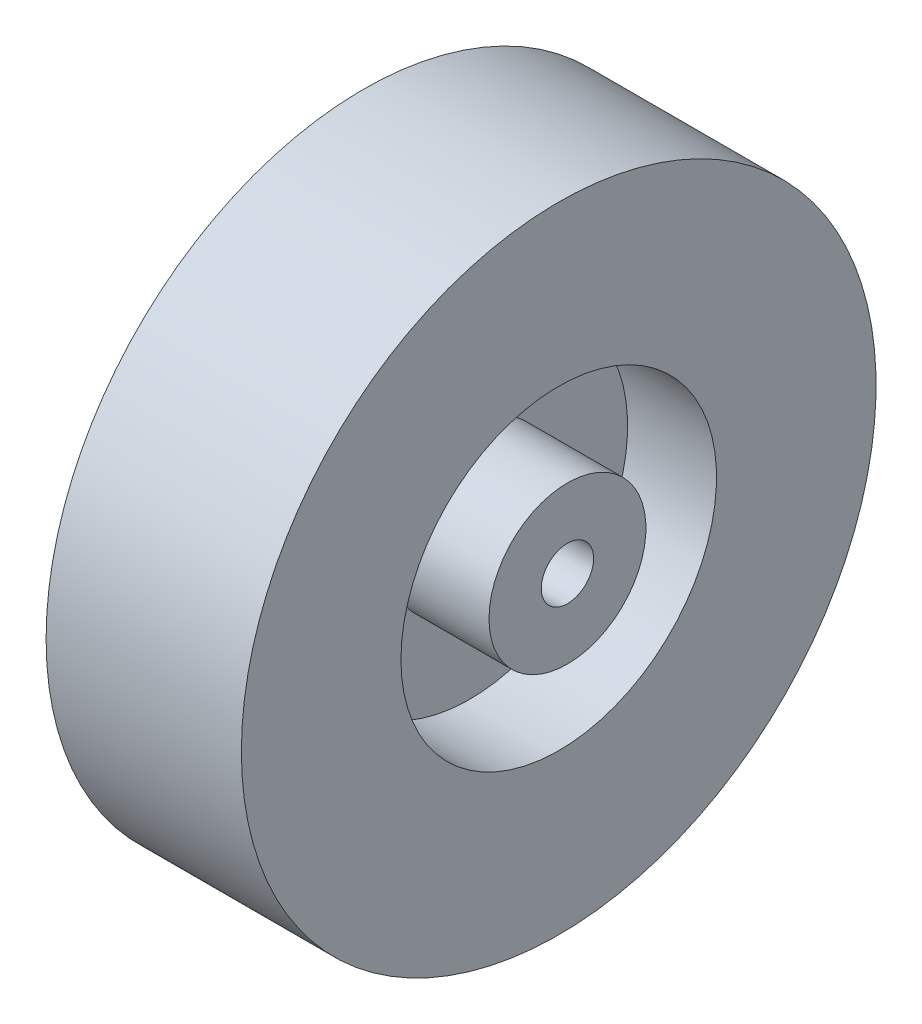
ISO-10303-21;
HEADER;
FILE_DESCRIPTION(('STEP AP214'),'2;1');
FILE_NAME('part.step','',(''),(''),'','','');
FILE_SCHEMA(('AUTOMOTIVE_DESIGN { 1 0 10303 214 1 1 1 1 }'));
ENDSEC;
DATA;
#1=APPLICATION_CONTEXT('core data for automotive mechanical design processes');
#2=APPLICATION_PROTOCOL_DEFINITION('international standard','automotive_design',2000,#1);
#3=PRODUCT_CONTEXT('',#1,'mechanical');
#4=PRODUCT('Part','Part','',(#3));
#5=PRODUCT_RELATED_PRODUCT_CATEGORY('part','',(#4));
#6=PRODUCT_DEFINITION_FORMATION('','',#4);
#7=PRODUCT_DEFINITION_CONTEXT('part definition',#1,'design');
#8=PRODUCT_DEFINITION('design','',#6,#7);
#9=PRODUCT_DEFINITION_SHAPE('','',#8);
#10=(LENGTH_UNIT() NAMED_UNIT(*) SI_UNIT(.MILLI.,.METRE.));
#11=(NAMED_UNIT(*) PLANE_ANGLE_UNIT() SI_UNIT($,.RADIAN.));
#12=(NAMED_UNIT(*) SI_UNIT($,.STERADIAN.) SOLID_ANGLE_UNIT());
#13=UNCERTAINTY_MEASURE_WITH_UNIT(LENGTH_MEASURE(1.E-05),#10,'distance_accuracy_value','');
#14=(GEOMETRIC_REPRESENTATION_CONTEXT(3) GLOBAL_UNCERTAINTY_ASSIGNED_CONTEXT((#13)) GLOBAL_UNIT_ASSIGNED_CONTEXT((#10,
#11,#12)) REPRESENTATION_CONTEXT('',''));
#15=CARTESIAN_POINT('',(0.,0.,0.));
#16=DIRECTION('',(0.,0.,1.));
#17=DIRECTION('',(1.,0.,0.));
#18=AXIS2_PLACEMENT_3D('',#15,#16,#17);
#19=CARTESIAN_POINT('',(-0.0128570073831025,0.,0.));
#20=DIRECTION('',(-1.,0.,0.));
#21=DIRECTION('',(0.,0.,1.));
#22=AXIS2_PLACEMENT_3D('',#19,#20,#21);
#23=CYLINDRICAL_SURFACE('',#22,4.5);
#24=CARTESIAN_POINT('',(0.487142992616897,0.,0.));
#25=DIRECTION('',(-1.,0.,0.));
#26=DIRECTION('',(0.,0.,1.));
#27=AXIS2_PLACEMENT_3D('',#24,#25,#26);
#28=CIRCLE('',#27,4.5);
#29=CARTESIAN_POINT('',(0.487142992616897,0.,4.5));
#30=VERTEX_POINT('',#29);
#31=EDGE_CURVE('E69',#30,#30,#28,.T.);
#32=ORIENTED_EDGE('',*,*,#31,.F.);
#33=EDGE_LOOP('',(#32));
#34=FACE_BOUND('',#33,.T.);
#35=CARTESIAN_POINT('',(6.0871429926169,0.,0.));
#36=DIRECTION('',(-1.,0.,0.));
#37=DIRECTION('',(0.,0.,1.));
#38=AXIS2_PLACEMENT_3D('',#35,#36,#37);
#39=CIRCLE('',#38,4.5);
#40=CARTESIAN_POINT('',(6.0871429926169,0.,4.5));
#41=VERTEX_POINT('',#40);
#42=EDGE_CURVE('E10',#41,#41,#39,.T.);
#43=ORIENTED_EDGE('',*,*,#42,.T.);
#44=EDGE_LOOP('',(#43));
#45=FACE_BOUND('',#44,.T.);
#46=ADVANCED_FACE('F35',(#34,#45),#23,.T.);
#47=CARTESIAN_POINT('',(6.0871429926169,4.5,0.));
#48=DIRECTION('',(-1.,0.,0.));
#49=DIRECTION('',(0.,0.,1.));
#50=AXIS2_PLACEMENT_3D('',#47,#48,#49);
#51=PLANE('',#50);
#52=CARTESIAN_POINT('',(6.0871429926169,0.,0.));
#53=DIRECTION('',(1.,0.,0.));
#54=DIRECTION('',(0.,0.,-1.));
#55=AXIS2_PLACEMENT_3D('',#52,#53,#54);
#56=CIRCLE('',#55,1.5);
#57=CARTESIAN_POINT('',(6.0871429926169,0.,-1.5));
#58=VERTEX_POINT('',#57);
#59=EDGE_CURVE('E73',#58,#58,#56,.T.);
#60=ORIENTED_EDGE('',*,*,#59,.F.);
#61=EDGE_LOOP('',(#60));
#62=FACE_BOUND('',#61,.T.);
#63=ORIENTED_EDGE('',*,*,#42,.F.);
#64=EDGE_LOOP('',(#63));
#65=FACE_BOUND('',#64,.T.);
#66=ADVANCED_FACE('F88',(#62,#65),#51,.F.);
#67=CARTESIAN_POINT('',(-6.1128570073831,4.5,0.));
#68=DIRECTION('',(1.,0.,0.));
#69=DIRECTION('',(0.,0.,-1.));
#70=AXIS2_PLACEMENT_3D('',#67,#68,#69);
#71=PLANE('',#70);
#72=CARTESIAN_POINT('',(-6.1128570073831,0.,0.));
#73=DIRECTION('',(-1.,0.,0.));
#74=DIRECTION('',(0.,0.,1.));
#75=AXIS2_PLACEMENT_3D('',#72,#73,#74);
#76=CIRCLE('',#75,4.5);
#77=CARTESIAN_POINT('',(-6.1128570073831,0.,4.5));
#78=VERTEX_POINT('',#77);
#79=EDGE_CURVE('E41',#78,#78,#76,.T.);
#80=ORIENTED_EDGE('',*,*,#79,.T.);
#81=EDGE_LOOP('',(#80));
#82=FACE_BOUND('',#81,.T.);
#83=ADVANCED_FACE('F91',(#82),#71,.F.);
#84=CARTESIAN_POINT('',(-0.0128570073831025,0.,0.));
#85=DIRECTION('',(-1.,0.,0.));
#86=DIRECTION('',(0.,0.,1.));
#87=AXIS2_PLACEMENT_3D('',#84,#85,#86);
#88=CYLINDRICAL_SURFACE('',#87,4.5);
#89=ORIENTED_EDGE('',*,*,#79,.F.);
#90=EDGE_LOOP('',(#89));
#91=FACE_BOUND('',#90,.T.);
#92=CARTESIAN_POINT('',(-0.512857007383101,0.,0.));
#93=DIRECTION('',(-1.,0.,0.));
#94=DIRECTION('',(0.,0.,1.));
#95=AXIS2_PLACEMENT_3D('',#92,#93,#94);
#96=CIRCLE('',#95,4.5);
#97=CARTESIAN_POINT('',(-0.512857007383101,0.,4.5));
#98=VERTEX_POINT('',#97);
#99=EDGE_CURVE('E45',#98,#98,#96,.T.);
#100=ORIENTED_EDGE('',*,*,#99,.T.);
#101=EDGE_LOOP('',(#100));
#102=FACE_BOUND('',#101,.T.);
#103=ADVANCED_FACE('F96',(#91,#102),#88,.T.);
#104=CARTESIAN_POINT('',(-0.512857007383101,9.05,0.));
#105=DIRECTION('',(1.,0.,0.));
#106=DIRECTION('',(0.,0.,-1.));
#107=AXIS2_PLACEMENT_3D('',#104,#105,#106);
#108=PLANE('',#107);
#109=ORIENTED_EDGE('',*,*,#99,.F.);
#110=EDGE_LOOP('',(#109));
#111=FACE_BOUND('',#110,.T.);
#112=CARTESIAN_POINT('',(-0.512857007383102,0.,0.));
#113=DIRECTION('',(-1.,0.,0.));
#114=DIRECTION('',(0.,0.,1.));
#115=AXIS2_PLACEMENT_3D('',#112,#113,#114);
#116=CIRCLE('',#115,9.05);
#117=CARTESIAN_POINT('',(-0.512857007383102,0.,9.05));
#118=VERTEX_POINT('',#117);
#119=EDGE_CURVE('E49',#118,#118,#116,.T.);
#120=ORIENTED_EDGE('',*,*,#119,.T.);
#121=EDGE_LOOP('',(#120));
#122=FACE_BOUND('',#121,.T.);
#123=ADVANCED_FACE('F102',(#111,#122),#108,.F.);
#124=CARTESIAN_POINT('',(-0.0128570073831025,0.,0.));
#125=DIRECTION('',(-1.,0.,0.));
#126=DIRECTION('',(0.,0.,1.));
#127=AXIS2_PLACEMENT_3D('',#124,#125,#126);
#128=CYLINDRICAL_SURFACE('',#127,9.05);
#129=ORIENTED_EDGE('',*,*,#119,.F.);
#130=EDGE_LOOP('',(#129));
#131=FACE_BOUND('',#130,.T.);
#132=CARTESIAN_POINT('',(-5.6128570073831,0.,0.));
#133=DIRECTION('',(-1.,0.,0.));
#134=DIRECTION('',(0.,0.,1.));
#135=AXIS2_PLACEMENT_3D('',#132,#133,#134);
#136=CIRCLE('',#135,9.05);
#137=CARTESIAN_POINT('',(-5.6128570073831,0.,9.05));
#138=VERTEX_POINT('',#137);
#139=EDGE_CURVE('E54',#138,#138,#136,.T.);
#140=ORIENTED_EDGE('',*,*,#139,.T.);
#141=EDGE_LOOP('',(#140));
#142=FACE_BOUND('',#141,.T.);
#143=ADVANCED_FACE('F106',(#131,#142),#128,.F.);
#144=CARTESIAN_POINT('',(-5.6128570073831,18.2,0.));
#145=DIRECTION('',(1.,0.,0.));
#146=DIRECTION('',(0.,0.,-1.));
#147=AXIS2_PLACEMENT_3D('',#144,#145,#146);
#148=PLANE('',#147);
#149=ORIENTED_EDGE('',*,*,#139,.F.);
#150=EDGE_LOOP('',(#149));
#151=FACE_BOUND('',#150,.T.);
#152=CARTESIAN_POINT('',(-5.6128570073831,0.,0.));
#153=DIRECTION('',(-1.,0.,0.));
#154=DIRECTION('',(0.,0.,1.));
#155=AXIS2_PLACEMENT_3D('',#152,#153,#154);
#156=CIRCLE('',#155,18.2);
#157=CARTESIAN_POINT('',(-5.6128570073831,0.,18.2));
#158=VERTEX_POINT('',#157);
#159=EDGE_CURVE('E57',#158,#158,#156,.T.);
#160=ORIENTED_EDGE('',*,*,#159,.T.);
#161=EDGE_LOOP('',(#160));
#162=FACE_BOUND('',#161,.T.);
#163=ADVANCED_FACE('F110',(#151,#162),#148,.F.);
#164=CARTESIAN_POINT('',(-0.0128570073831025,0.,0.));
#165=DIRECTION('',(-1.,0.,0.));
#166=DIRECTION('',(0.,0.,1.));
#167=AXIS2_PLACEMENT_3D('',#164,#165,#166);
#168=CYLINDRICAL_SURFACE('',#167,18.2);
#169=ORIENTED_EDGE('',*,*,#159,.F.);
#170=EDGE_LOOP('',(#169));
#171=FACE_BOUND('',#170,.T.);
#172=CARTESIAN_POINT('',(5.5871429926169,0.,0.));
#173=DIRECTION('',(-1.,0.,0.));
#174=DIRECTION('',(0.,0.,1.));
#175=AXIS2_PLACEMENT_3D('',#172,#173,#174);
#176=CIRCLE('',#175,18.2);
#177=CARTESIAN_POINT('',(5.5871429926169,0.,18.2));
#178=VERTEX_POINT('',#177);
#179=EDGE_CURVE('E60',#178,#178,#176,.T.);
#180=ORIENTED_EDGE('',*,*,#179,.T.);
#181=EDGE_LOOP('',(#180));
#182=FACE_BOUND('',#181,.T.);
#183=ADVANCED_FACE('F114',(#171,#182),#168,.T.);
#184=CARTESIAN_POINT('',(5.5871429926169,18.2,0.));
#185=DIRECTION('',(-1.,0.,0.));
#186=DIRECTION('',(0.,0.,1.));
#187=AXIS2_PLACEMENT_3D('',#184,#185,#186);
#188=PLANE('',#187);
#189=ORIENTED_EDGE('',*,*,#179,.F.);
#190=EDGE_LOOP('',(#189));
#191=FACE_BOUND('',#190,.T.);
#192=CARTESIAN_POINT('',(5.5871429926169,0.,0.));
#193=DIRECTION('',(-1.,0.,0.));
#194=DIRECTION('',(0.,0.,1.));
#195=AXIS2_PLACEMENT_3D('',#192,#193,#194);
#196=CIRCLE('',#195,9.05);
#197=CARTESIAN_POINT('',(5.5871429926169,0.,9.05));
#198=VERTEX_POINT('',#197);
#199=EDGE_CURVE('E63',#198,#198,#196,.T.);
#200=ORIENTED_EDGE('',*,*,#199,.T.);
#201=EDGE_LOOP('',(#200));
#202=FACE_BOUND('',#201,.T.);
#203=ADVANCED_FACE('F118',(#191,#202),#188,.F.);
#204=CARTESIAN_POINT('',(-0.0128570073831025,0.,0.));
#205=DIRECTION('',(-1.,0.,0.));
#206=DIRECTION('',(0.,0.,1.));
#207=AXIS2_PLACEMENT_3D('',#204,#205,#206);
#208=CYLINDRICAL_SURFACE('',#207,9.05);
#209=ORIENTED_EDGE('',*,*,#199,.F.);
#210=EDGE_LOOP('',(#209));
#211=FACE_BOUND('',#210,.T.);
#212=CARTESIAN_POINT('',(0.487142992616898,0.,0.));
#213=DIRECTION('',(-1.,0.,0.));
#214=DIRECTION('',(0.,0.,1.));
#215=AXIS2_PLACEMENT_3D('',#212,#213,#214);
#216=CIRCLE('',#215,9.05);
#217=CARTESIAN_POINT('',(0.487142992616898,0.,9.05));
#218=VERTEX_POINT('',#217);
#219=EDGE_CURVE('E66',#218,#218,#216,.T.);
#220=ORIENTED_EDGE('',*,*,#219,.T.);
#221=EDGE_LOOP('',(#220));
#222=FACE_BOUND('',#221,.T.);
#223=ADVANCED_FACE('F122',(#211,#222),#208,.F.);
#224=CARTESIAN_POINT('',(0.487142992616898,9.05,0.));
#225=DIRECTION('',(-1.,0.,0.));
#226=DIRECTION('',(0.,0.,1.));
#227=AXIS2_PLACEMENT_3D('',#224,#225,#226);
#228=PLANE('',#227);
#229=ORIENTED_EDGE('',*,*,#219,.F.);
#230=EDGE_LOOP('',(#229));
#231=FACE_BOUND('',#230,.T.);
#232=ORIENTED_EDGE('',*,*,#31,.T.);
#233=EDGE_LOOP('',(#232));
#234=FACE_BOUND('',#233,.T.);
#235=ADVANCED_FACE('F84',(#231,#234),#228,.F.);
#236=CARTESIAN_POINT('',(-1.4128570073831,0.,0.));
#237=DIRECTION('',(1.,0.,0.));
#238=DIRECTION('',(0.,0.,-1.));
#239=AXIS2_PLACEMENT_3D('',#236,#237,#238);
#240=CYLINDRICAL_SURFACE('',#239,1.5);
#241=CARTESIAN_POINT('',(-1.4128570073831,0.,0.));
#242=DIRECTION('',(1.,0.,0.));
#243=DIRECTION('',(0.,0.,-1.));
#244=AXIS2_PLACEMENT_3D('',#241,#242,#243);
#245=CIRCLE('',#244,1.5);
#246=CARTESIAN_POINT('',(-1.4128570073831,0.,-1.5));
#247=VERTEX_POINT('',#246);
#248=EDGE_CURVE('E72',#247,#247,#245,.T.);
#249=ORIENTED_EDGE('',*,*,#248,.F.);
#250=EDGE_LOOP('',(#249));
#251=FACE_BOUND('',#250,.T.);
#252=ORIENTED_EDGE('',*,*,#59,.T.);
#253=EDGE_LOOP('',(#252));
#254=FACE_BOUND('',#253,.T.);
#255=ADVANCED_FACE('F81',(#251,#254),#240,.F.);
#256=CARTESIAN_POINT('',(-1.4128570073831,0.,0.));
#257=DIRECTION('',(1.,0.,0.));
#258=DIRECTION('',(0.,0.,-1.));
#259=AXIS2_PLACEMENT_3D('',#256,#257,#258);
#260=PLANE('',#259);
#261=ORIENTED_EDGE('',*,*,#248,.T.);
#262=EDGE_LOOP('',(#261));
#263=FACE_BOUND('',#262,.T.);
#264=ADVANCED_FACE('F79',(#263),#260,.T.);
#265=CLOSED_SHELL('',(#46,#66,#83,#103,#123,#143,#163,#183,#203,#223,#235,#255,#264));
#266=MANIFOLD_SOLID_BREP('B2',#265);
#267=ADVANCED_BREP_SHAPE_REPRESENTATION('',(#18,#266),#14);
#268=SHAPE_DEFINITION_REPRESENTATION(#9,#267);
ENDSEC;
END-ISO-10303-21;
